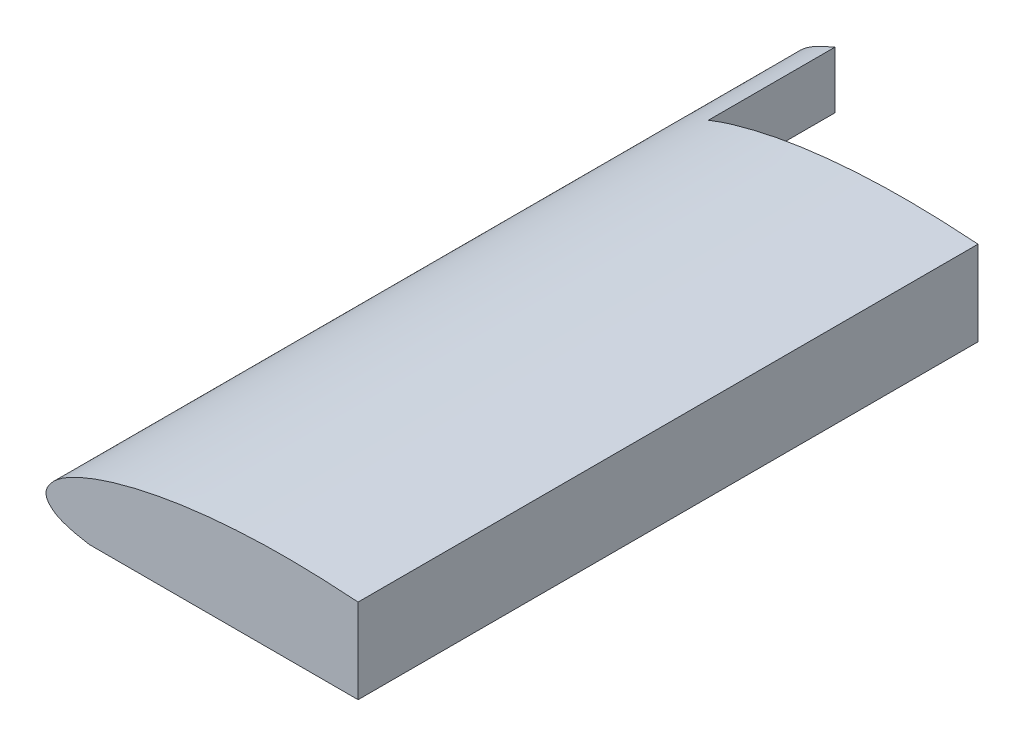
ISO-10303-21;
HEADER;
FILE_DESCRIPTION(('STEP AP214'),'2;1');
FILE_NAME('part.step','',(''),(''),'','','');
FILE_SCHEMA(('AUTOMOTIVE_DESIGN { 1 0 10303 214 1 1 1 1 }'));
ENDSEC;
DATA;
#1=APPLICATION_CONTEXT('core data for automotive mechanical design processes');
#2=APPLICATION_PROTOCOL_DEFINITION('international standard','automotive_design',2000,#1);
#3=PRODUCT_CONTEXT('',#1,'mechanical');
#4=PRODUCT('Part','Part','',(#3));
#5=PRODUCT_RELATED_PRODUCT_CATEGORY('part','',(#4));
#6=PRODUCT_DEFINITION_FORMATION('','',#4);
#7=PRODUCT_DEFINITION_CONTEXT('part definition',#1,'design');
#8=PRODUCT_DEFINITION('design','',#6,#7);
#9=PRODUCT_DEFINITION_SHAPE('','',#8);
#10=(LENGTH_UNIT() NAMED_UNIT(*) SI_UNIT(.MILLI.,.METRE.));
#11=(NAMED_UNIT(*) PLANE_ANGLE_UNIT() SI_UNIT($,.RADIAN.));
#12=(NAMED_UNIT(*) SI_UNIT($,.STERADIAN.) SOLID_ANGLE_UNIT());
#13=UNCERTAINTY_MEASURE_WITH_UNIT(LENGTH_MEASURE(1.E-05),#10,'distance_accuracy_value','');
#14=(GEOMETRIC_REPRESENTATION_CONTEXT(3) GLOBAL_UNCERTAINTY_ASSIGNED_CONTEXT((#13)) GLOBAL_UNIT_ASSIGNED_CONTEXT((#10,
#11,#12)) REPRESENTATION_CONTEXT('',''));
#15=CARTESIAN_POINT('',(0.,0.,0.));
#16=DIRECTION('',(0.,0.,1.));
#17=DIRECTION('',(1.,0.,0.));
#18=AXIS2_PLACEMENT_3D('',#15,#16,#17);
#19=CARTESIAN_POINT('',(70.7887578321964,0.859359846233949,310.));
#20=CARTESIAN_POINT('',(69.6518808161122,1.21189534273912,310.));
#21=CARTESIAN_POINT('',(67.3836132020491,1.91526504607307,310.));
#22=CARTESIAN_POINT('',(62.8355874060464,3.2089625474314,310.));
#23=CARTESIAN_POINT('',(57.142358964783,4.66167545188801,310.));
#24=CARTESIAN_POINT('',(50.2849949729531,6.13718629079709,310.));
#25=CARTESIAN_POINT('',(43.42520695613,7.3899084649567,310.));
#26=CARTESIAN_POINT('',(36.5514457016177,8.35264131984866,310.));
#27=CARTESIAN_POINT('',(29.6688001662191,9.0437269963835,310.));
#28=CARTESIAN_POINT('',(23.9101199489519,9.24938307953397,310.));
#29=CARTESIAN_POINT('',(19.3009038769469,9.09184016741403,310.));
#30=CARTESIAN_POINT('',(15.8330318726326,8.79341871438005,310.));
#31=CARTESIAN_POINT('',(12.3507504323489,8.29634912127752,310.));
#32=CARTESIAN_POINT('',(9.45703676517654,7.65335714233078,310.));
#33=CARTESIAN_POINT('',(7.13273814544781,6.98307131906437,310.));
#34=CARTESIAN_POINT('',(5.37518287857745,6.3350409692731,310.));
#35=CARTESIAN_POINT('',(3.86989417689246,5.62040346010015,310.));
#36=CARTESIAN_POINT('',(2.55452079873379,4.74862681311946,310.));
#37=CARTESIAN_POINT('',(1.3858638224939,3.31346833608391,310.));
#38=CARTESIAN_POINT('',(2.55234000366483,2.14394344322138,310.));
#39=CARTESIAN_POINT('',(3.76733276479163,1.65842265557331,310.));
#40=CARTESIAN_POINT('',(5.22227960900436,1.30854699490644,310.));
#41=CARTESIAN_POINT('',(6.94758377048033,1.0962436049102,310.));
#42=CARTESIAN_POINT('',(9.24451165759755,0.908421193879692,310.));
#43=CARTESIAN_POINT('',(12.1188995661309,0.816105562361939,310.));
#44=CARTESIAN_POINT('',(15.5699635565447,0.7921874233918,310.));
#45=CARTESIAN_POINT('',(19.0216407566096,0.855576841690771,310.));
#46=CARTESIAN_POINT('',(23.6250559332223,0.910031447941681,310.));
#47=CARTESIAN_POINT('',(29.3785935606808,0.985285128708163,310.));
#48=CARTESIAN_POINT('',(36.2827743099587,1.00351315096037,310.));
#49=CARTESIAN_POINT('',(43.1857387144221,1.0504172118788,310.));
#50=CARTESIAN_POINT('',(50.0878736469793,1.05465818821242,310.));
#51=CARTESIAN_POINT('',(56.9882987024852,0.994100654881515,310.));
#52=CARTESIAN_POINT('',(62.7368617559884,0.884956070851332,310.));
#53=CARTESIAN_POINT('',(67.3349244841207,0.784711291231528,310.));
#54=CARTESIAN_POINT('',(69.6333279399396,0.714983200245966,310.));
#55=CARTESIAN_POINT('',(70.7824986421946,0.680120095997702,310.));
#56=B_SPLINE_CURVE_WITH_KNOTS('',3,(#19,#20,#21,#22,#23,#24,#25,#26,#27,#28,#29,#30,#31,#32,#33,
#34,#35,#36,#37,#38,#39,#40,#41,#42,#43,#44,#45,#46,#47,#48,#49,#50,#51,#52,#53,#54,#55),
.UNSPECIFIED.,.F.,.F.,(4,1,1,1,1,1,1,1,1,1,1,1,1,1,1,1,1,1,1,1,1,1,1,1,1,1,1,1,1,1,1,1,1,1,4),
(0.,0.0253048857109568,0.0504876533905406,0.100520432651506,0.150190715723339,0.199586606894546,
0.248740009224029,0.297715538989186,0.346600594361287,0.371102737044854,0.395726297170324,
0.420570145356384,0.445825119255769,0.458702215791061,0.471919981785349,0.485786002851729,
0.493461050828321,0.506863029175844,0.516147770049506,0.522766002591757,0.535269014058866,
0.54755113395783,0.559786370715185,0.584228898401235,0.608680810066395,0.633151283581104,
0.657621757095813,0.706558114036031,0.755481870433228,0.804405626830425,0.853320223819576,
0.902221408341012,0.951113135961066,0.975557227893806,1.),.UNSPECIFIED.);
#57=DIRECTION('',(0.,0.,-1.));
#58=VECTOR('',#57,1.);
#59=SURFACE_OF_LINEAR_EXTRUSION('',#56,#58);
#60=DIRECTION('',(0.,0.,-1.));
#61=VECTOR('',#60,1.);
#62=CARTESIAN_POINT('',(5.68714196495074,1.26474870458315,167.207341033457));
#63=LINE('',#62,#61);
#64=CARTESIAN_POINT('',(5.68714196495074,1.26474870458311,144.804225590156));
#65=VERTEX_POINT('',#64);
#66=CARTESIAN_POINT('',(5.68714196495074,1.26474870340376,133.303197697266));
#67=VERTEX_POINT('',#66);
#68=EDGE_CURVE('E149',#65,#67,#63,.T.);
#69=ORIENTED_EDGE('',*,*,#68,.F.);
#70=CARTESIAN_POINT('',(70.7887578321964,0.859359846233949,144.804225590156));
#71=CARTESIAN_POINT('',(69.6518808161122,1.21189534273912,144.804225590156));
#72=CARTESIAN_POINT('',(67.3836132020491,1.91526504607307,144.804225590156));
#73=CARTESIAN_POINT('',(62.8355874060464,3.2089625474314,144.804225590156));
#74=CARTESIAN_POINT('',(57.142358964783,4.66167545188801,144.804225590156));
#75=CARTESIAN_POINT('',(50.2849949729531,6.13718629079709,144.804225590156));
#76=CARTESIAN_POINT('',(43.42520695613,7.3899084649567,144.804225590156));
#77=CARTESIAN_POINT('',(36.5514457016177,8.35264131984866,144.804225590156));
#78=CARTESIAN_POINT('',(29.6688001662191,9.0437269963835,144.804225590156));
#79=CARTESIAN_POINT('',(23.9101199489519,9.24938307953397,144.804225590156));
#80=CARTESIAN_POINT('',(19.3009038769469,9.09184016741403,144.804225590156));
#81=CARTESIAN_POINT('',(15.8330318726326,8.79341871438005,144.804225590156));
#82=CARTESIAN_POINT('',(12.3507504323489,8.29634912127752,144.804225590156));
#83=CARTESIAN_POINT('',(9.45703676517654,7.65335714233078,144.804225590156));
#84=CARTESIAN_POINT('',(7.13273814544781,6.98307131906437,144.804225590156));
#85=CARTESIAN_POINT('',(5.37518287857745,6.3350409692731,144.804225590156));
#86=CARTESIAN_POINT('',(3.86989417689246,5.62040346010015,144.804225590156));
#87=CARTESIAN_POINT('',(2.55452079873379,4.74862681311946,144.804225590156));
#88=CARTESIAN_POINT('',(1.3858638224939,3.31346833608391,144.804225590156));
#89=CARTESIAN_POINT('',(2.55234000366483,2.14394344322138,144.804225590156));
#90=CARTESIAN_POINT('',(3.76733276479163,1.65842265557331,144.804225590156));
#91=CARTESIAN_POINT('',(5.22227960900436,1.30854699490644,144.804225590156));
#92=CARTESIAN_POINT('',(6.94758377048033,1.0962436049102,144.804225590156));
#93=CARTESIAN_POINT('',(9.24451165759755,0.908421193879692,144.804225590156));
#94=CARTESIAN_POINT('',(12.1188995661309,0.816105562361939,144.804225590156));
#95=CARTESIAN_POINT('',(15.5699635565447,0.7921874233918,144.804225590156));
#96=CARTESIAN_POINT('',(19.0216407566096,0.855576841690771,144.804225590156));
#97=CARTESIAN_POINT('',(23.6250559332223,0.910031447941681,144.804225590156));
#98=CARTESIAN_POINT('',(29.3785935606808,0.985285128708163,144.804225590156));
#99=CARTESIAN_POINT('',(36.2827743099587,1.00351315096037,144.804225590156));
#100=CARTESIAN_POINT('',(43.1857387144221,1.0504172118788,144.804225590156));
#101=CARTESIAN_POINT('',(50.0878736469793,1.05465818821242,144.804225590156));
#102=CARTESIAN_POINT('',(56.9882987024852,0.994100654881515,144.804225590156));
#103=CARTESIAN_POINT('',(62.7368617559884,0.884956070851332,144.804225590156));
#104=CARTESIAN_POINT('',(67.3349244841207,0.784711291231528,144.804225590156));
#105=CARTESIAN_POINT('',(69.6333279399396,0.714983200245966,144.804225590156));
#106=CARTESIAN_POINT('',(70.7824986421946,0.680120095997702,144.804225590156));
#107=B_SPLINE_CURVE_WITH_KNOTS('',3,(#70,#71,#72,#73,#74,#75,#76,#77,#78,#79,#80,#81,#82,#83,
#84,#85,#86,#87,#88,#89,#90,#91,#92,#93,#94,#95,#96,#97,#98,#99,#100,#101,#102,#103,#104,#105,
#106),.UNSPECIFIED.,.F.,.F.,(4,1,1,1,1,1,1,1,1,1,1,1,1,1,1,1,1,1,1,1,1,1,1,1,1,1,1,1,1,1,1,1,1,
1,4),(0.,0.0253048857109568,0.0504876533905406,0.100520432651506,0.150190715723339,
0.199586606894546,0.248740009224029,0.297715538989186,0.346600594361287,0.371102737044854,
0.395726297170324,0.420570145356384,0.445825119255769,0.458702215791061,0.471919981785349,
0.485786002851729,0.493461050828321,0.506863029175844,0.516147770049506,0.522766002591757,
0.535269014058866,0.54755113395783,0.559786370715185,0.584228898401235,0.608680810066395,
0.633151283581104,0.657621757095813,0.706558114036031,0.755481870433228,0.804405626830425,
0.853320223819576,0.902221408341012,0.951113135961066,0.975557227893806,1.),.UNSPECIFIED.);
#108=CARTESIAN_POINT('',(5.78531729702368,1.25,144.804225590156));
#109=VERTEX_POINT('',#108);
#110=EDGE_CURVE('E138',#109,#65,#107,.F.);
#111=ORIENTED_EDGE('',*,*,#110,.F.);
#112=DIRECTION('',(0.,0.,-1.));
#113=VECTOR('',#112,1.);
#114=CARTESIAN_POINT('',(5.78531729702368,1.25,310.));
#115=LINE('',#114,#113);
#116=CARTESIAN_POINT('',(5.78531729702368,1.25,201.111484369648));
#117=VERTEX_POINT('',#116);
#118=EDGE_CURVE('E147',#109,#117,#115,.F.);
#119=ORIENTED_EDGE('',*,*,#118,.T.);
#120=CARTESIAN_POINT('',(70.7887578321964,0.859359846233949,201.111484369648));
#121=CARTESIAN_POINT('',(69.6518808161122,1.21189534273912,201.111484369648));
#122=CARTESIAN_POINT('',(67.3836132020491,1.91526504607307,201.111484369648));
#123=CARTESIAN_POINT('',(62.8355874060464,3.2089625474314,201.111484369648));
#124=CARTESIAN_POINT('',(57.142358964783,4.66167545188801,201.111484369648));
#125=CARTESIAN_POINT('',(50.2849949729531,6.13718629079709,201.111484369648));
#126=CARTESIAN_POINT('',(43.42520695613,7.3899084649567,201.111484369648));
#127=CARTESIAN_POINT('',(36.5514457016177,8.35264131984866,201.111484369648));
#128=CARTESIAN_POINT('',(29.6688001662191,9.0437269963835,201.111484369648));
#129=CARTESIAN_POINT('',(23.9101199489519,9.24938307953397,201.111484369648));
#130=CARTESIAN_POINT('',(19.3009038769469,9.09184016741403,201.111484369648));
#131=CARTESIAN_POINT('',(15.8330318726326,8.79341871438005,201.111484369648));
#132=CARTESIAN_POINT('',(12.3507504323489,8.29634912127752,201.111484369648));
#133=CARTESIAN_POINT('',(9.45703676517654,7.65335714233078,201.111484369648));
#134=CARTESIAN_POINT('',(7.13273814544781,6.98307131906437,201.111484369648));
#135=CARTESIAN_POINT('',(5.37518287857745,6.3350409692731,201.111484369648));
#136=CARTESIAN_POINT('',(3.86989417689246,5.62040346010015,201.111484369648));
#137=CARTESIAN_POINT('',(2.55452079873379,4.74862681311946,201.111484369648));
#138=CARTESIAN_POINT('',(1.3858638224939,3.31346833608391,201.111484369648));
#139=CARTESIAN_POINT('',(2.55234000366483,2.14394344322138,201.111484369648));
#140=CARTESIAN_POINT('',(3.76733276479163,1.65842265557331,201.111484369648));
#141=CARTESIAN_POINT('',(5.22227960900436,1.30854699490644,201.111484369648));
#142=CARTESIAN_POINT('',(6.94758377048033,1.0962436049102,201.111484369648));
#143=CARTESIAN_POINT('',(9.24451165759755,0.908421193879692,201.111484369648));
#144=CARTESIAN_POINT('',(12.1188995661309,0.816105562361939,201.111484369648));
#145=CARTESIAN_POINT('',(15.5699635565447,0.7921874233918,201.111484369648));
#146=CARTESIAN_POINT('',(19.0216407566096,0.855576841690771,201.111484369648));
#147=CARTESIAN_POINT('',(23.6250559332223,0.910031447941681,201.111484369648));
#148=CARTESIAN_POINT('',(29.3785935606808,0.985285128708163,201.111484369648));
#149=CARTESIAN_POINT('',(36.2827743099587,1.00351315096037,201.111484369648));
#150=CARTESIAN_POINT('',(43.1857387144221,1.0504172118788,201.111484369648));
#151=CARTESIAN_POINT('',(50.0878736469793,1.05465818821242,201.111484369648));
#152=CARTESIAN_POINT('',(56.9882987024852,0.994100654881515,201.111484369648));
#153=CARTESIAN_POINT('',(62.7368617559884,0.884956070851332,201.111484369648));
#154=CARTESIAN_POINT('',(67.3349244841207,0.784711291231528,201.111484369648));
#155=CARTESIAN_POINT('',(69.6333279399396,0.714983200245966,201.111484369648));
#156=CARTESIAN_POINT('',(70.7824986421946,0.680120095997702,201.111484369648));
#157=B_SPLINE_CURVE_WITH_KNOTS('',3,(#120,#121,#122,#123,#124,#125,#126,#127,#128,#129,#130,
#131,#132,#133,#134,#135,#136,#137,#138,#139,#140,#141,#142,#143,#144,#145,#146,#147,#148,#149,
#150,#151,#152,#153,#154,#155,#156),.UNSPECIFIED.,.F.,.F.,(4,1,1,1,1,1,1,1,1,1,1,1,1,1,1,1,1,1,
1,1,1,1,1,1,1,1,1,1,1,1,1,1,1,1,4),(0.,0.0253048857109568,0.0504876533905406,0.100520432651506,
0.150190715723339,0.199586606894546,0.248740009224029,0.297715538989186,0.346600594361287,
0.371102737044854,0.395726297170324,0.420570145356384,0.445825119255769,0.458702215791061,
0.471919981785349,0.485786002851729,0.493461050828321,0.506863029175844,0.516147770049506,
0.522766002591757,0.535269014058866,0.54755113395783,0.559786370715185,0.584228898401235,
0.608680810066395,0.633151283581104,0.657621757095813,0.706558114036031,0.755481870433228,
0.804405626830425,0.853320223819576,0.902221408341012,0.951113135961066,0.975557227893806,1.),.UNSPECIFIED.);
#158=CARTESIAN_POINT('',(30.182823618361,8.93322645664951,201.111484369648));
#159=VERTEX_POINT('',#158);
#160=EDGE_CURVE('E166',#117,#159,#157,.F.);
#161=ORIENTED_EDGE('',*,*,#160,.T.);
#162=DIRECTION('',(0.,0.,-1.));
#163=VECTOR('',#162,1.);
#164=CARTESIAN_POINT('',(30.182823618361,8.93322645664951,310.));
#165=LINE('',#164,#163);
#166=CARTESIAN_POINT('',(30.182823618361,8.93322645664951,144.804225590156));
#167=VERTEX_POINT('',#166);
#168=EDGE_CURVE('E156',#159,#167,#165,.T.);
#169=ORIENTED_EDGE('',*,*,#168,.T.);
#170=CARTESIAN_POINT('',(5.68714196495074,6.43246886809175,144.804225590156));
#171=VERTEX_POINT('',#170);
#172=EDGE_CURVE('E102',#171,#167,#107,.F.);
#173=ORIENTED_EDGE('',*,*,#172,.F.);
#174=DIRECTION('',(0.,0.,-1.));
#175=VECTOR('',#174,1.);
#176=CARTESIAN_POINT('',(5.68714196495075,6.43246886809092,167.207341033457));
#177=LINE('',#176,#175);
#178=CARTESIAN_POINT('',(5.68714196495074,6.43246886809175,133.303197697266));
#179=VERTEX_POINT('',#178);
#180=EDGE_CURVE('E153',#179,#171,#177,.F.);
#181=ORIENTED_EDGE('',*,*,#180,.F.);
#182=CARTESIAN_POINT('',(70.7887578321964,0.859359846233949,133.303197697266));
#183=CARTESIAN_POINT('',(69.6518808161122,1.21189534273912,133.303197697266));
#184=CARTESIAN_POINT('',(67.3836132020491,1.91526504607307,133.303197697266));
#185=CARTESIAN_POINT('',(62.8355874060464,3.2089625474314,133.303197697266));
#186=CARTESIAN_POINT('',(57.142358964783,4.66167545188801,133.303197697266));
#187=CARTESIAN_POINT('',(50.2849949729531,6.13718629079709,133.303197697266));
#188=CARTESIAN_POINT('',(43.42520695613,7.3899084649567,133.303197697266));
#189=CARTESIAN_POINT('',(36.5514457016177,8.35264131984866,133.303197697266));
#190=CARTESIAN_POINT('',(29.6688001662191,9.0437269963835,133.303197697266));
#191=CARTESIAN_POINT('',(23.9101199489519,9.24938307953397,133.303197697266));
#192=CARTESIAN_POINT('',(19.3009038769469,9.09184016741403,133.303197697266));
#193=CARTESIAN_POINT('',(15.8330318726326,8.79341871438005,133.303197697266));
#194=CARTESIAN_POINT('',(12.3507504323489,8.29634912127752,133.303197697266));
#195=CARTESIAN_POINT('',(9.45703676517654,7.65335714233078,133.303197697266));
#196=CARTESIAN_POINT('',(7.13273814544781,6.98307131906437,133.303197697266));
#197=CARTESIAN_POINT('',(5.37518287857745,6.3350409692731,133.303197697266));
#198=CARTESIAN_POINT('',(3.86989417689246,5.62040346010015,133.303197697266));
#199=CARTESIAN_POINT('',(2.55452079873379,4.74862681311946,133.303197697266));
#200=CARTESIAN_POINT('',(1.3858638224939,3.31346833608391,133.303197697266));
#201=CARTESIAN_POINT('',(2.55234000366483,2.14394344322138,133.303197697266));
#202=CARTESIAN_POINT('',(3.76733276479163,1.65842265557331,133.303197697266));
#203=CARTESIAN_POINT('',(5.22227960900436,1.30854699490644,133.303197697266));
#204=CARTESIAN_POINT('',(6.94758377048033,1.0962436049102,133.303197697266));
#205=CARTESIAN_POINT('',(9.24451165759755,0.908421193879692,133.303197697266));
#206=CARTESIAN_POINT('',(12.1188995661309,0.816105562361939,133.303197697266));
#207=CARTESIAN_POINT('',(15.5699635565447,0.7921874233918,133.303197697266));
#208=CARTESIAN_POINT('',(19.0216407566096,0.855576841690771,133.303197697266));
#209=CARTESIAN_POINT('',(23.6250559332223,0.910031447941681,133.303197697266));
#210=CARTESIAN_POINT('',(29.3785935606808,0.985285128708163,133.303197697266));
#211=CARTESIAN_POINT('',(36.2827743099587,1.00351315096037,133.303197697266));
#212=CARTESIAN_POINT('',(43.1857387144221,1.0504172118788,133.303197697266));
#213=CARTESIAN_POINT('',(50.0878736469793,1.05465818821242,133.303197697266));
#214=CARTESIAN_POINT('',(56.9882987024852,0.994100654881515,133.303197697266));
#215=CARTESIAN_POINT('',(62.7368617559884,0.884956070851332,133.303197697266));
#216=CARTESIAN_POINT('',(67.3349244841207,0.784711291231528,133.303197697266));
#217=CARTESIAN_POINT('',(69.6333279399396,0.714983200245966,133.303197697266));
#218=CARTESIAN_POINT('',(70.7824986421946,0.680120095997702,133.303197697266));
#219=B_SPLINE_CURVE_WITH_KNOTS('',3,(#182,#183,#184,#185,#186,#187,#188,#189,#190,#191,#192,
#193,#194,#195,#196,#197,#198,#199,#200,#201,#202,#203,#204,#205,#206,#207,#208,#209,#210,#211,
#212,#213,#214,#215,#216,#217,#218),.UNSPECIFIED.,.F.,.F.,(4,1,1,1,1,1,1,1,1,1,1,1,1,1,1,1,1,1,
1,1,1,1,1,1,1,1,1,1,1,1,1,1,1,1,4),(0.,0.0253048857109568,0.0504876533905406,0.100520432651506,
0.150190715723339,0.199586606894546,0.248740009224029,0.297715538989186,0.346600594361287,
0.371102737044854,0.395726297170324,0.420570145356384,0.445825119255769,0.458702215791061,
0.471919981785349,0.485786002851729,0.493461050828321,0.506863029175844,0.516147770049506,
0.522766002591757,0.535269014058866,0.54755113395783,0.559786370715185,0.584228898401235,
0.608680810066395,0.633151283581104,0.657621757095813,0.706558114036031,0.755481870433228,
0.804405626830425,0.853320223819576,0.902221408341012,0.951113135961066,0.975557227893806,1.),.UNSPECIFIED.);
#220=EDGE_CURVE('E152',#67,#179,#219,.F.);
#221=ORIENTED_EDGE('',*,*,#220,.F.);
#222=EDGE_LOOP('',(#69,#111,#119,#161,#169,#173,#181,#221));
#223=FACE_BOUND('',#222,.T.);
#224=ADVANCED_FACE('F87',(#223),#59,.F.);
#225=CARTESIAN_POINT('',(0.,1.25,0.));
#226=DIRECTION('',(0.,1.,0.));
#227=DIRECTION('',(0.,0.,1.));
#228=AXIS2_PLACEMENT_3D('',#225,#226,#227);
#229=PLANE('',#228);
#230=DIRECTION('',(1.,0.,0.));
#231=VECTOR('',#230,1.);
#232=CARTESIAN_POINT('',(5.68714196495074,1.25,144.804225590156));
#233=LINE('',#232,#231);
#234=CARTESIAN_POINT('',(30.182823618361,1.25,144.804225590156));
#235=VERTEX_POINT('',#234);
#236=EDGE_CURVE('E135',#109,#235,#233,.T.);
#237=ORIENTED_EDGE('',*,*,#236,.T.);
#238=DIRECTION('',(0.,0.,-1.));
#239=VECTOR('',#238,1.);
#240=CARTESIAN_POINT('',(30.182823618361,1.25,201.111484369648));
#241=LINE('',#240,#239);
#242=CARTESIAN_POINT('',(30.182823618361,1.25,201.111484369648));
#243=VERTEX_POINT('',#242);
#244=EDGE_CURVE('E165',#243,#235,#241,.T.);
#245=ORIENTED_EDGE('',*,*,#244,.F.);
#246=DIRECTION('',(1.,0.,0.));
#247=VECTOR('',#246,1.);
#248=CARTESIAN_POINT('',(-5.93721600674257,1.25,201.111484369648));
#249=LINE('',#248,#247);
#250=EDGE_CURVE('E110',#117,#243,#249,.T.);
#251=ORIENTED_EDGE('',*,*,#250,.F.);
#252=ORIENTED_EDGE('',*,*,#118,.F.);
#253=EDGE_LOOP('',(#237,#245,#251,#252));
#254=FACE_BOUND('',#253,.T.);
#255=ADVANCED_FACE('F151',(#254),#229,.F.);
#256=CARTESIAN_POINT('',(-5.93721600674258,12.676700152837,133.303197697266));
#257=DIRECTION('',(0.,0.,-1.));
#258=DIRECTION('',(-1.,0.,0.));
#259=AXIS2_PLACEMENT_3D('',#256,#257,#258);
#260=PLANE('',#259);
#261=ORIENTED_EDGE('',*,*,#220,.T.);
#262=DIRECTION('',(0.,-1.,0.));
#263=VECTOR('',#262,1.);
#264=CARTESIAN_POINT('',(5.68714196495074,12.676700152837,133.303197697266));
#265=LINE('',#264,#263);
#266=EDGE_CURVE('E12',#179,#67,#265,.T.);
#267=ORIENTED_EDGE('',*,*,#266,.T.);
#268=EDGE_LOOP('',(#261,#267));
#269=FACE_BOUND('',#268,.T.);
#270=ADVANCED_FACE('F200',(#269),#260,.T.);
#271=CARTESIAN_POINT('',(30.182823618361,12.676700152837,201.111484369648));
#272=DIRECTION('',(-1.,0.,0.));
#273=DIRECTION('',(0.,0.,1.));
#274=AXIS2_PLACEMENT_3D('',#271,#272,#273);
#275=PLANE('',#274);
#276=DIRECTION('',(0.,-1.,0.));
#277=VECTOR('',#276,1.);
#278=CARTESIAN_POINT('',(30.182823618361,12.676700152837,144.804225590156));
#279=LINE('',#278,#277);
#280=EDGE_CURVE('E95',#167,#235,#279,.T.);
#281=ORIENTED_EDGE('',*,*,#280,.F.);
#282=ORIENTED_EDGE('',*,*,#168,.F.);
#283=DIRECTION('',(0.,-1.,0.));
#284=VECTOR('',#283,1.);
#285=CARTESIAN_POINT('',(30.182823618361,12.676700152837,201.111484369648));
#286=LINE('',#285,#284);
#287=EDGE_CURVE('E162',#159,#243,#286,.T.);
#288=ORIENTED_EDGE('',*,*,#287,.T.);
#289=ORIENTED_EDGE('',*,*,#244,.T.);
#290=EDGE_LOOP('',(#281,#282,#288,#289));
#291=FACE_BOUND('',#290,.T.);
#292=ADVANCED_FACE('F175',(#291),#275,.F.);
#293=CARTESIAN_POINT('',(-5.93721600674257,12.676700152837,201.111484369648));
#294=DIRECTION('',(0.,0.,-1.));
#295=DIRECTION('',(-1.,0.,0.));
#296=AXIS2_PLACEMENT_3D('',#293,#294,#295);
#297=PLANE('',#296);
#298=ORIENTED_EDGE('',*,*,#160,.F.);
#299=ORIENTED_EDGE('',*,*,#250,.T.);
#300=ORIENTED_EDGE('',*,*,#287,.F.);
#301=EDGE_LOOP('',(#298,#299,#300));
#302=FACE_BOUND('',#301,.T.);
#303=ADVANCED_FACE('F178',(#302),#297,.F.);
#304=CARTESIAN_POINT('',(5.68714196495074,9.24938307953397,133.303197697266));
#305=DIRECTION('',(1.,0.,0.));
#306=DIRECTION('',(0.,0.,-1.));
#307=AXIS2_PLACEMENT_3D('',#304,#305,#306);
#308=PLANE('',#307);
#309=ORIENTED_EDGE('',*,*,#180,.T.);
#310=DIRECTION('',(0.,-1.,0.));
#311=VECTOR('',#310,1.);
#312=CARTESIAN_POINT('',(5.68714196495074,9.24938307953397,144.804225590156));
#313=LINE('',#312,#311);
#314=EDGE_CURVE('E143',#171,#65,#313,.T.);
#315=ORIENTED_EDGE('',*,*,#314,.T.);
#316=ORIENTED_EDGE('',*,*,#68,.T.);
#317=ORIENTED_EDGE('',*,*,#266,.F.);
#318=EDGE_LOOP('',(#309,#315,#316,#317));
#319=FACE_BOUND('',#318,.T.);
#320=ADVANCED_FACE('F197',(#319),#308,.T.);
#321=CARTESIAN_POINT('',(5.68714196495074,9.24938307953397,144.804225590156));
#322=DIRECTION('',(0.,0.,-1.));
#323=DIRECTION('',(-1.,0.,0.));
#324=AXIS2_PLACEMENT_3D('',#321,#322,#323);
#325=PLANE('',#324);
#326=ORIENTED_EDGE('',*,*,#110,.T.);
#327=ORIENTED_EDGE('',*,*,#314,.F.);
#328=ORIENTED_EDGE('',*,*,#172,.T.);
#329=ORIENTED_EDGE('',*,*,#280,.T.);
#330=ORIENTED_EDGE('',*,*,#236,.F.);
#331=EDGE_LOOP('',(#326,#327,#328,#329,#330));
#332=FACE_BOUND('',#331,.T.);
#333=ADVANCED_FACE('F137',(#332),#325,.T.);
#334=CLOSED_SHELL('',(#224,#255,#270,#292,#303,#320,#333));
#335=MANIFOLD_SOLID_BREP('B2',#334);
#336=ADVANCED_BREP_SHAPE_REPRESENTATION('',(#18,#335),#14);
#337=SHAPE_DEFINITION_REPRESENTATION(#9,#336);
ENDSEC;
END-ISO-10303-21;
